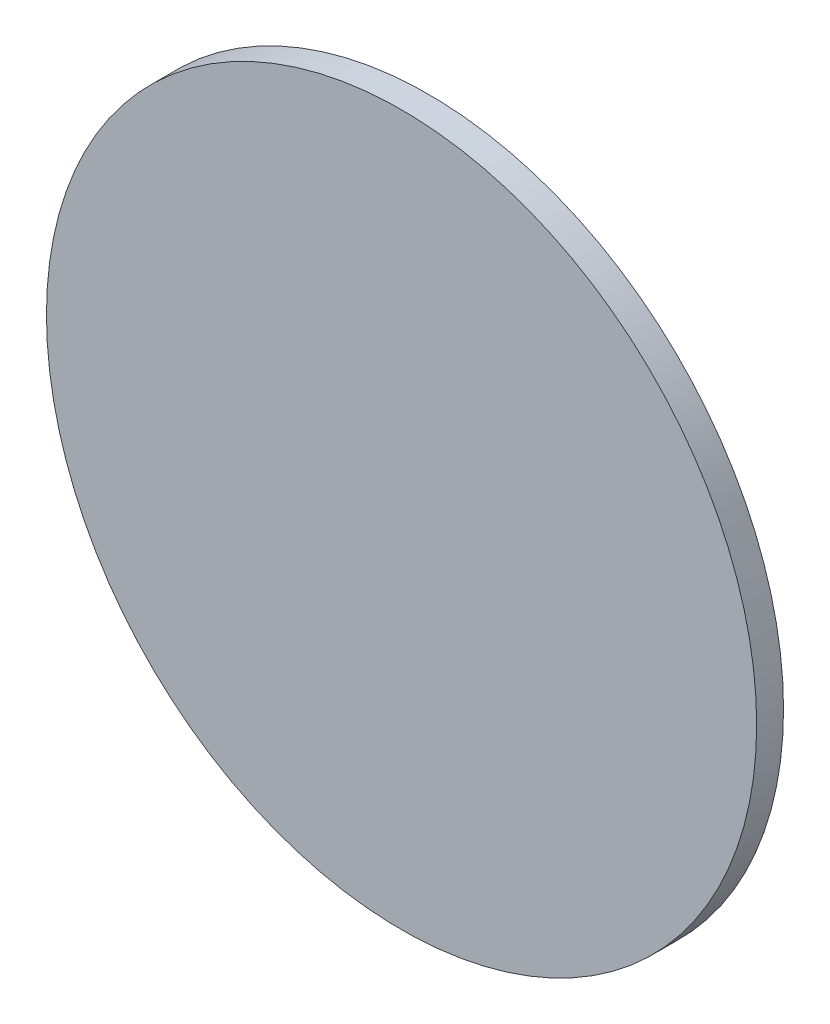
ISO-10303-21;
HEADER;
FILE_DESCRIPTION(('STEP AP214'),'2;1');
FILE_NAME('part.step','',(''),(''),'','','');
FILE_SCHEMA(('AUTOMOTIVE_DESIGN { 1 0 10303 214 1 1 1 1 }'));
ENDSEC;
DATA;
#1=APPLICATION_CONTEXT('core data for automotive mechanical design processes');
#2=APPLICATION_PROTOCOL_DEFINITION('international standard','automotive_design',2000,#1);
#3=PRODUCT_CONTEXT('',#1,'mechanical');
#4=PRODUCT('Part','Part','',(#3));
#5=PRODUCT_RELATED_PRODUCT_CATEGORY('part','',(#4));
#6=PRODUCT_DEFINITION_FORMATION('','',#4);
#7=PRODUCT_DEFINITION_CONTEXT('part definition',#1,'design');
#8=PRODUCT_DEFINITION('design','',#6,#7);
#9=PRODUCT_DEFINITION_SHAPE('','',#8);
#10=(LENGTH_UNIT() NAMED_UNIT(*) SI_UNIT(.MILLI.,.METRE.));
#11=(NAMED_UNIT(*) PLANE_ANGLE_UNIT() SI_UNIT($,.RADIAN.));
#12=(NAMED_UNIT(*) SI_UNIT($,.STERADIAN.) SOLID_ANGLE_UNIT());
#13=UNCERTAINTY_MEASURE_WITH_UNIT(LENGTH_MEASURE(1.E-05),#10,'distance_accuracy_value','');
#14=(GEOMETRIC_REPRESENTATION_CONTEXT(3) GLOBAL_UNCERTAINTY_ASSIGNED_CONTEXT((#13)) GLOBAL_UNIT_ASSIGNED_CONTEXT((#10,
#11,#12)) REPRESENTATION_CONTEXT('',''));
#15=CARTESIAN_POINT('',(0.,0.,0.));
#16=DIRECTION('',(0.,0.,1.));
#17=DIRECTION('',(1.,0.,0.));
#18=AXIS2_PLACEMENT_3D('',#15,#16,#17);
#19=CARTESIAN_POINT('',(-13.2297371851662,0.,2.54));
#20=DIRECTION('',(0.,0.,-1.));
#21=DIRECTION('',(-1.,0.,0.));
#22=AXIS2_PLACEMENT_3D('',#19,#20,#21);
#23=CYLINDRICAL_SURFACE('',#22,33.5626361886998);
#24=CARTESIAN_POINT('',(-13.2297371851662,0.,2.54));
#25=DIRECTION('',(0.,0.,1.));
#26=DIRECTION('',(1.,0.,0.));
#27=AXIS2_PLACEMENT_3D('',#24,#25,#26);
#28=CIRCLE('',#27,33.5626361886998);
#29=CARTESIAN_POINT('',(20.3328990035336,0.,2.54));
#30=VERTEX_POINT('',#29);
#31=EDGE_CURVE('E10',#30,#30,#28,.T.);
#32=ORIENTED_EDGE('',*,*,#31,.F.);
#33=EDGE_LOOP('',(#32));
#34=FACE_BOUND('',#33,.T.);
#35=CARTESIAN_POINT('',(-13.2297371851662,0.,0.));
#36=DIRECTION('',(0.,0.,1.));
#37=DIRECTION('',(1.,0.,0.));
#38=AXIS2_PLACEMENT_3D('',#35,#36,#37);
#39=CIRCLE('',#38,33.5626361886998);
#40=CARTESIAN_POINT('',(20.3328990035336,0.,0.));
#41=VERTEX_POINT('',#40);
#42=EDGE_CURVE('E34',#41,#41,#39,.T.);
#43=ORIENTED_EDGE('',*,*,#42,.T.);
#44=EDGE_LOOP('',(#43));
#45=FACE_BOUND('',#44,.T.);
#46=ADVANCED_FACE('F31',(#34,#45),#23,.T.);
#47=CARTESIAN_POINT('',(-13.2297371851662,0.,2.54));
#48=DIRECTION('',(0.,0.,1.));
#49=DIRECTION('',(1.,0.,0.));
#50=AXIS2_PLACEMENT_3D('',#47,#48,#49);
#51=PLANE('',#50);
#52=ORIENTED_EDGE('',*,*,#31,.T.);
#53=EDGE_LOOP('',(#52));
#54=FACE_BOUND('',#53,.T.);
#55=ADVANCED_FACE('F46',(#54),#51,.T.);
#56=CARTESIAN_POINT('',(-13.2297371851662,0.,0.));
#57=DIRECTION('',(0.,0.,1.));
#58=DIRECTION('',(1.,0.,0.));
#59=AXIS2_PLACEMENT_3D('',#56,#57,#58);
#60=PLANE('',#59);
#61=ORIENTED_EDGE('',*,*,#42,.F.);
#62=EDGE_LOOP('',(#61));
#63=FACE_BOUND('',#62,.T.);
#64=ADVANCED_FACE('F44',(#63),#60,.F.);
#65=CLOSED_SHELL('',(#46,#55,#64));
#66=MANIFOLD_SOLID_BREP('B2',#65);
#67=ADVANCED_BREP_SHAPE_REPRESENTATION('',(#18,#66),#14);
#68=SHAPE_DEFINITION_REPRESENTATION(#9,#67);
ENDSEC;
END-ISO-10303-21;
